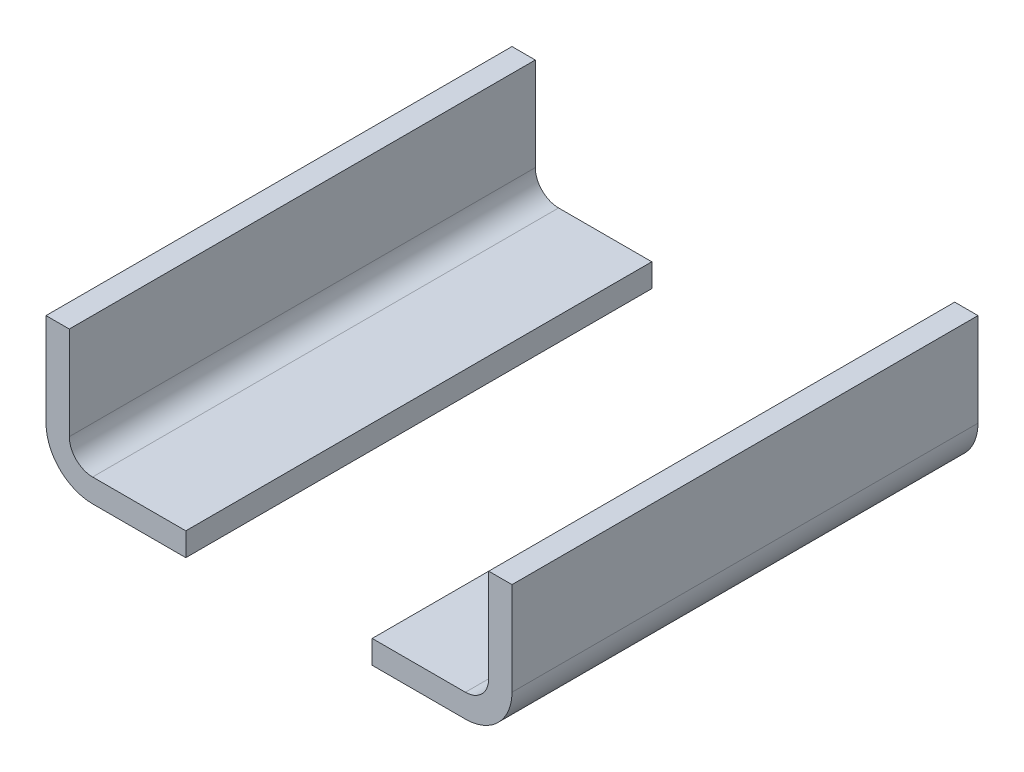
ISO-10303-21;
HEADER;
FILE_DESCRIPTION(('STEP AP214'),'2;1');
FILE_NAME('part.step','',(''),(''),'','','');
FILE_SCHEMA(('AUTOMOTIVE_DESIGN { 1 0 10303 214 1 1 1 1 }'));
ENDSEC;
DATA;
#1=APPLICATION_CONTEXT('core data for automotive mechanical design processes');
#2=APPLICATION_PROTOCOL_DEFINITION('international standard','automotive_design',2000,#1);
#3=PRODUCT_CONTEXT('',#1,'mechanical');
#4=PRODUCT('Part','Part','',(#3));
#5=PRODUCT_RELATED_PRODUCT_CATEGORY('part','',(#4));
#6=PRODUCT_DEFINITION_FORMATION('','',#4);
#7=PRODUCT_DEFINITION_CONTEXT('part definition',#1,'design');
#8=PRODUCT_DEFINITION('design','',#6,#7);
#9=PRODUCT_DEFINITION_SHAPE('','',#8);
#10=(LENGTH_UNIT() NAMED_UNIT(*) SI_UNIT(.MILLI.,.METRE.));
#11=(NAMED_UNIT(*) PLANE_ANGLE_UNIT() SI_UNIT($,.RADIAN.));
#12=(NAMED_UNIT(*) SI_UNIT($,.STERADIAN.) SOLID_ANGLE_UNIT());
#13=UNCERTAINTY_MEASURE_WITH_UNIT(LENGTH_MEASURE(1.E-05),#10,'distance_accuracy_value','');
#14=(GEOMETRIC_REPRESENTATION_CONTEXT(3) GLOBAL_UNCERTAINTY_ASSIGNED_CONTEXT((#13)) GLOBAL_UNIT_ASSIGNED_CONTEXT((#10,
#11,#12)) REPRESENTATION_CONTEXT('',''));
#15=CARTESIAN_POINT('',(0.,0.,0.));
#16=DIRECTION('',(0.,0.,1.));
#17=DIRECTION('',(1.,0.,0.));
#18=AXIS2_PLACEMENT_3D('',#15,#16,#17);
#19=CARTESIAN_POINT('',(40.,0.,200.));
#20=DIRECTION('',(1.,0.,0.));
#21=DIRECTION('',(0.,0.,-1.));
#22=AXIS2_PLACEMENT_3D('',#19,#20,#21);
#23=PLANE('',#22);
#24=DIRECTION('',(0.,-1.,0.));
#25=VECTOR('',#24,1.);
#26=CARTESIAN_POINT('',(40.,0.,0.));
#27=LINE('',#26,#25);
#28=CARTESIAN_POINT('',(40.,10.,0.));
#29=VERTEX_POINT('',#28);
#30=CARTESIAN_POINT('',(40.,0.,0.));
#31=VERTEX_POINT('',#30);
#32=EDGE_CURVE('E143',#29,#31,#27,.T.);
#33=ORIENTED_EDGE('',*,*,#32,.T.);
#34=DIRECTION('',(0.,0.,-1.));
#35=VECTOR('',#34,1.);
#36=CARTESIAN_POINT('',(40.,0.,200.));
#37=LINE('',#36,#35);
#38=CARTESIAN_POINT('',(40.,0.,200.));
#39=VERTEX_POINT('',#38);
#40=EDGE_CURVE('E12',#39,#31,#37,.T.);
#41=ORIENTED_EDGE('',*,*,#40,.F.);
#42=DIRECTION('',(0.,-1.,0.));
#43=VECTOR('',#42,1.);
#44=CARTESIAN_POINT('',(40.,0.,200.));
#45=LINE('',#44,#43);
#46=CARTESIAN_POINT('',(40.,10.,200.));
#47=VERTEX_POINT('',#46);
#48=EDGE_CURVE('E157',#47,#39,#45,.T.);
#49=ORIENTED_EDGE('',*,*,#48,.F.);
#50=DIRECTION('',(0.,0.,-1.));
#51=VECTOR('',#50,1.);
#52=CARTESIAN_POINT('',(40.,10.,200.));
#53=LINE('',#52,#51);
#54=EDGE_CURVE('E139',#47,#29,#53,.T.);
#55=ORIENTED_EDGE('',*,*,#54,.T.);
#56=EDGE_LOOP('',(#33,#41,#49,#55));
#57=FACE_BOUND('',#56,.T.);
#58=ADVANCED_FACE('F47',(#57),#23,.F.);
#59=CARTESIAN_POINT('',(40.,0.,200.));
#60=DIRECTION('',(0.,1.,0.));
#61=DIRECTION('',(-1.,0.,0.));
#62=AXIS2_PLACEMENT_3D('',#59,#60,#61);
#63=PLANE('',#62);
#64=DIRECTION('',(1.,0.,0.));
#65=VECTOR('',#64,1.);
#66=CARTESIAN_POINT('',(40.,0.,0.));
#67=LINE('',#66,#65);
#68=CARTESIAN_POINT('',(80.,0.,0.));
#69=VERTEX_POINT('',#68);
#70=EDGE_CURVE('E146',#31,#69,#67,.T.);
#71=ORIENTED_EDGE('',*,*,#70,.T.);
#72=DIRECTION('',(0.,0.,-1.));
#73=VECTOR('',#72,1.);
#74=CARTESIAN_POINT('',(80.,0.,200.));
#75=LINE('',#74,#73);
#76=CARTESIAN_POINT('',(80.,0.,200.));
#77=VERTEX_POINT('',#76);
#78=EDGE_CURVE('E55',#77,#69,#75,.T.);
#79=ORIENTED_EDGE('',*,*,#78,.F.);
#80=DIRECTION('',(1.,0.,0.));
#81=VECTOR('',#80,1.);
#82=CARTESIAN_POINT('',(40.,0.,200.));
#83=LINE('',#82,#81);
#84=EDGE_CURVE('E106',#39,#77,#83,.T.);
#85=ORIENTED_EDGE('',*,*,#84,.F.);
#86=ORIENTED_EDGE('',*,*,#40,.T.);
#87=EDGE_LOOP('',(#71,#79,#85,#86));
#88=FACE_BOUND('',#87,.T.);
#89=ADVANCED_FACE('F192',(#88),#63,.F.);
#90=CARTESIAN_POINT('',(80.,20.,200.));
#91=DIRECTION('',(0.,0.,-1.));
#92=DIRECTION('',(-1.,0.,0.));
#93=AXIS2_PLACEMENT_3D('',#90,#91,#92);
#94=CYLINDRICAL_SURFACE('',#93,20.);
#95=CARTESIAN_POINT('',(80.,20.,0.));
#96=DIRECTION('',(0.,0.,1.));
#97=DIRECTION('',(1.,0.,0.));
#98=AXIS2_PLACEMENT_3D('',#95,#96,#97);
#99=CIRCLE('',#98,20.);
#100=CARTESIAN_POINT('',(100.,20.,0.));
#101=VERTEX_POINT('',#100);
#102=EDGE_CURVE('E148',#69,#101,#99,.T.);
#103=ORIENTED_EDGE('',*,*,#102,.T.);
#104=DIRECTION('',(0.,0.,-1.));
#105=VECTOR('',#104,1.);
#106=CARTESIAN_POINT('',(100.,20.,200.));
#107=LINE('',#106,#105);
#108=CARTESIAN_POINT('',(100.,20.,200.));
#109=VERTEX_POINT('',#108);
#110=EDGE_CURVE('E164',#109,#101,#107,.T.);
#111=ORIENTED_EDGE('',*,*,#110,.F.);
#112=CARTESIAN_POINT('',(80.,20.,200.));
#113=DIRECTION('',(0.,0.,1.));
#114=DIRECTION('',(1.,0.,0.));
#115=AXIS2_PLACEMENT_3D('',#112,#113,#114);
#116=CIRCLE('',#115,20.);
#117=EDGE_CURVE('E172',#77,#109,#116,.T.);
#118=ORIENTED_EDGE('',*,*,#117,.F.);
#119=ORIENTED_EDGE('',*,*,#78,.T.);
#120=EDGE_LOOP('',(#103,#111,#118,#119));
#121=FACE_BOUND('',#120,.T.);
#122=ADVANCED_FACE('F170',(#121),#94,.T.);
#123=CARTESIAN_POINT('',(100.,20.,200.));
#124=DIRECTION('',(-1.,0.,0.));
#125=DIRECTION('',(0.,0.,1.));
#126=AXIS2_PLACEMENT_3D('',#123,#124,#125);
#127=PLANE('',#126);
#128=DIRECTION('',(0.,1.,0.));
#129=VECTOR('',#128,1.);
#130=CARTESIAN_POINT('',(100.,20.,0.));
#131=LINE('',#130,#129);
#132=CARTESIAN_POINT('',(100.,60.,0.));
#133=VERTEX_POINT('',#132);
#134=EDGE_CURVE('E150',#101,#133,#131,.T.);
#135=ORIENTED_EDGE('',*,*,#134,.T.);
#136=DIRECTION('',(0.,0.,-1.));
#137=VECTOR('',#136,1.);
#138=CARTESIAN_POINT('',(100.,60.,200.));
#139=LINE('',#138,#137);
#140=CARTESIAN_POINT('',(100.,60.,200.));
#141=VERTEX_POINT('',#140);
#142=EDGE_CURVE('E161',#141,#133,#139,.T.);
#143=ORIENTED_EDGE('',*,*,#142,.F.);
#144=DIRECTION('',(0.,1.,0.));
#145=VECTOR('',#144,1.);
#146=CARTESIAN_POINT('',(100.,20.,200.));
#147=LINE('',#146,#145);
#148=EDGE_CURVE('E184',#109,#141,#147,.T.);
#149=ORIENTED_EDGE('',*,*,#148,.F.);
#150=ORIENTED_EDGE('',*,*,#110,.T.);
#151=EDGE_LOOP('',(#135,#143,#149,#150));
#152=FACE_BOUND('',#151,.T.);
#153=ADVANCED_FACE('F180',(#152),#127,.F.);
#154=CARTESIAN_POINT('',(90.,60.,200.));
#155=DIRECTION('',(0.,-1.,0.));
#156=DIRECTION('',(0.,0.,-1.));
#157=AXIS2_PLACEMENT_3D('',#154,#155,#156);
#158=PLANE('',#157);
#159=DIRECTION('',(-1.,0.,0.));
#160=VECTOR('',#159,1.);
#161=CARTESIAN_POINT('',(90.,60.,0.));
#162=LINE('',#161,#160);
#163=CARTESIAN_POINT('',(90.,60.,0.));
#164=VERTEX_POINT('',#163);
#165=EDGE_CURVE('E152',#133,#164,#162,.T.);
#166=ORIENTED_EDGE('',*,*,#165,.T.);
#167=DIRECTION('',(0.,0.,-1.));
#168=VECTOR('',#167,1.);
#169=CARTESIAN_POINT('',(90.,60.,200.));
#170=LINE('',#169,#168);
#171=CARTESIAN_POINT('',(90.,60.,200.));
#172=VERTEX_POINT('',#171);
#173=EDGE_CURVE('E134',#172,#164,#170,.T.);
#174=ORIENTED_EDGE('',*,*,#173,.F.);
#175=DIRECTION('',(-1.,0.,0.));
#176=VECTOR('',#175,1.);
#177=CARTESIAN_POINT('',(90.,60.,200.));
#178=LINE('',#177,#176);
#179=EDGE_CURVE('E125',#141,#172,#178,.T.);
#180=ORIENTED_EDGE('',*,*,#179,.F.);
#181=ORIENTED_EDGE('',*,*,#142,.T.);
#182=EDGE_LOOP('',(#166,#174,#180,#181));
#183=FACE_BOUND('',#182,.T.);
#184=ADVANCED_FACE('F183',(#183),#158,.F.);
#185=CARTESIAN_POINT('',(90.,20.,200.));
#186=DIRECTION('',(1.,0.,0.));
#187=DIRECTION('',(0.,0.,-1.));
#188=AXIS2_PLACEMENT_3D('',#185,#186,#187);
#189=PLANE('',#188);
#190=DIRECTION('',(0.,-1.,0.));
#191=VECTOR('',#190,1.);
#192=CARTESIAN_POINT('',(90.,20.,0.));
#193=LINE('',#192,#191);
#194=CARTESIAN_POINT('',(90.,20.,0.));
#195=VERTEX_POINT('',#194);
#196=EDGE_CURVE('E133',#164,#195,#193,.T.);
#197=ORIENTED_EDGE('',*,*,#196,.T.);
#198=DIRECTION('',(0.,0.,-1.));
#199=VECTOR('',#198,1.);
#200=CARTESIAN_POINT('',(90.,20.,200.));
#201=LINE('',#200,#199);
#202=CARTESIAN_POINT('',(90.,20.,200.));
#203=VERTEX_POINT('',#202);
#204=EDGE_CURVE('E130',#203,#195,#201,.T.);
#205=ORIENTED_EDGE('',*,*,#204,.F.);
#206=DIRECTION('',(0.,-1.,0.));
#207=VECTOR('',#206,1.);
#208=CARTESIAN_POINT('',(90.,20.,200.));
#209=LINE('',#208,#207);
#210=EDGE_CURVE('E119',#172,#203,#209,.T.);
#211=ORIENTED_EDGE('',*,*,#210,.F.);
#212=ORIENTED_EDGE('',*,*,#173,.T.);
#213=EDGE_LOOP('',(#197,#205,#211,#212));
#214=FACE_BOUND('',#213,.T.);
#215=ADVANCED_FACE('F131',(#214),#189,.F.);
#216=CARTESIAN_POINT('',(80.,20.,200.));
#217=DIRECTION('',(0.,0.,-1.));
#218=DIRECTION('',(-1.,0.,0.));
#219=AXIS2_PLACEMENT_3D('',#216,#217,#218);
#220=CYLINDRICAL_SURFACE('',#219,9.99999999999999);
#221=CARTESIAN_POINT('',(80.,20.,0.));
#222=DIRECTION('',(0.,0.,-1.));
#223=DIRECTION('',(1.,0.,0.));
#224=AXIS2_PLACEMENT_3D('',#221,#222,#223);
#225=CIRCLE('',#224,9.99999999999999);
#226=CARTESIAN_POINT('',(80.,10.,0.));
#227=VERTEX_POINT('',#226);
#228=EDGE_CURVE('E92',#195,#227,#225,.T.);
#229=ORIENTED_EDGE('',*,*,#228,.T.);
#230=DIRECTION('',(0.,0.,-1.));
#231=VECTOR('',#230,1.);
#232=CARTESIAN_POINT('',(80.,10.,200.));
#233=LINE('',#232,#231);
#234=CARTESIAN_POINT('',(80.,10.,200.));
#235=VERTEX_POINT('',#234);
#236=EDGE_CURVE('E135',#235,#227,#233,.T.);
#237=ORIENTED_EDGE('',*,*,#236,.F.);
#238=CARTESIAN_POINT('',(80.,20.,200.));
#239=DIRECTION('',(0.,0.,-1.));
#240=DIRECTION('',(1.,0.,0.));
#241=AXIS2_PLACEMENT_3D('',#238,#239,#240);
#242=CIRCLE('',#241,9.99999999999999);
#243=EDGE_CURVE('E123',#203,#235,#242,.T.);
#244=ORIENTED_EDGE('',*,*,#243,.F.);
#245=ORIENTED_EDGE('',*,*,#204,.T.);
#246=EDGE_LOOP('',(#229,#237,#244,#245));
#247=FACE_BOUND('',#246,.T.);
#248=ADVANCED_FACE('F137',(#247),#220,.F.);
#249=CARTESIAN_POINT('',(40.,10.,200.));
#250=DIRECTION('',(0.,-1.,0.));
#251=DIRECTION('',(1.,0.,0.));
#252=AXIS2_PLACEMENT_3D('',#249,#250,#251);
#253=PLANE('',#252);
#254=DIRECTION('',(-1.,0.,0.));
#255=VECTOR('',#254,1.);
#256=CARTESIAN_POINT('',(40.,10.,0.));
#257=LINE('',#256,#255);
#258=EDGE_CURVE('E98',#227,#29,#257,.T.);
#259=ORIENTED_EDGE('',*,*,#258,.T.);
#260=ORIENTED_EDGE('',*,*,#54,.F.);
#261=DIRECTION('',(-1.,0.,0.));
#262=VECTOR('',#261,1.);
#263=CARTESIAN_POINT('',(40.,10.,200.));
#264=LINE('',#263,#262);
#265=EDGE_CURVE('E63',#235,#47,#264,.T.);
#266=ORIENTED_EDGE('',*,*,#265,.F.);
#267=ORIENTED_EDGE('',*,*,#236,.T.);
#268=EDGE_LOOP('',(#259,#260,#266,#267));
#269=FACE_BOUND('',#268,.T.);
#270=ADVANCED_FACE('F208',(#269),#253,.F.);
#271=CARTESIAN_POINT('',(80.,20.,200.));
#272=DIRECTION('',(0.,0.,1.));
#273=DIRECTION('',(1.,0.,0.));
#274=AXIS2_PLACEMENT_3D('',#271,#272,#273);
#275=PLANE('',#274);
#276=ORIENTED_EDGE('',*,*,#48,.T.);
#277=ORIENTED_EDGE('',*,*,#84,.T.);
#278=ORIENTED_EDGE('',*,*,#117,.T.);
#279=ORIENTED_EDGE('',*,*,#148,.T.);
#280=ORIENTED_EDGE('',*,*,#179,.T.);
#281=ORIENTED_EDGE('',*,*,#210,.T.);
#282=ORIENTED_EDGE('',*,*,#243,.T.);
#283=ORIENTED_EDGE('',*,*,#265,.T.);
#284=EDGE_LOOP('',(#276,#277,#278,#279,#280,#281,#282,#283));
#285=FACE_BOUND('',#284,.T.);
#286=ADVANCED_FACE('F121',(#285),#275,.T.);
#287=CARTESIAN_POINT('',(80.,20.,0.));
#288=DIRECTION('',(0.,0.,1.));
#289=DIRECTION('',(1.,0.,0.));
#290=AXIS2_PLACEMENT_3D('',#287,#288,#289);
#291=PLANE('',#290);
#292=ORIENTED_EDGE('',*,*,#32,.F.);
#293=ORIENTED_EDGE('',*,*,#258,.F.);
#294=ORIENTED_EDGE('',*,*,#228,.F.);
#295=ORIENTED_EDGE('',*,*,#196,.F.);
#296=ORIENTED_EDGE('',*,*,#165,.F.);
#297=ORIENTED_EDGE('',*,*,#134,.F.);
#298=ORIENTED_EDGE('',*,*,#102,.F.);
#299=ORIENTED_EDGE('',*,*,#70,.F.);
#300=EDGE_LOOP('',(#292,#293,#294,#295,#296,#297,#298,#299));
#301=FACE_BOUND('',#300,.T.);
#302=ADVANCED_FACE('F176',(#301),#291,.F.);
#303=CLOSED_SHELL('',(#58,#89,#122,#153,#184,#215,#248,#270,#286,#302));
#304=MANIFOLD_SOLID_BREP('B2',#303);
#305=CARTESIAN_POINT('',(-40.,0.,200.));
#306=DIRECTION('',(-1.,0.,0.));
#307=DIRECTION('',(0.,0.,1.));
#308=AXIS2_PLACEMENT_3D('',#305,#306,#307);
#309=PLANE('',#308);
#310=DIRECTION('',(0.,1.,0.));
#311=VECTOR('',#310,1.);
#312=CARTESIAN_POINT('',(-40.,0.,0.));
#313=LINE('',#312,#311);
#314=CARTESIAN_POINT('',(-40.,0.,0.));
#315=VERTEX_POINT('',#314);
#316=CARTESIAN_POINT('',(-40.,10.,0.));
#317=VERTEX_POINT('',#316);
#318=EDGE_CURVE('E373',#315,#317,#313,.T.);
#319=ORIENTED_EDGE('',*,*,#318,.T.);
#320=DIRECTION('',(0.,0.,-1.));
#321=VECTOR('',#320,1.);
#322=CARTESIAN_POINT('',(-40.,10.,200.));
#323=LINE('',#322,#321);
#324=CARTESIAN_POINT('',(-40.,10.,200.));
#325=VERTEX_POINT('',#324);
#326=EDGE_CURVE('E45',#325,#317,#323,.T.);
#327=ORIENTED_EDGE('',*,*,#326,.F.);
#328=DIRECTION('',(0.,1.,0.));
#329=VECTOR('',#328,1.);
#330=CARTESIAN_POINT('',(-40.,0.,200.));
#331=LINE('',#330,#329);
#332=CARTESIAN_POINT('',(-40.,0.,200.));
#333=VERTEX_POINT('',#332);
#334=EDGE_CURVE('E387',#333,#325,#331,.T.);
#335=ORIENTED_EDGE('',*,*,#334,.F.);
#336=DIRECTION('',(0.,0.,-1.));
#337=VECTOR('',#336,1.);
#338=CARTESIAN_POINT('',(-40.,0.,200.));
#339=LINE('',#338,#337);
#340=EDGE_CURVE('E369',#333,#315,#339,.T.);
#341=ORIENTED_EDGE('',*,*,#340,.T.);
#342=EDGE_LOOP('',(#319,#327,#335,#341));
#343=FACE_BOUND('',#342,.T.);
#344=ADVANCED_FACE('F277',(#343),#309,.F.);
#345=CARTESIAN_POINT('',(-40.,10.,200.));
#346=DIRECTION('',(0.,-1.,0.));
#347=DIRECTION('',(1.,0.,0.));
#348=AXIS2_PLACEMENT_3D('',#345,#346,#347);
#349=PLANE('',#348);
#350=DIRECTION('',(-1.,0.,0.));
#351=VECTOR('',#350,1.);
#352=CARTESIAN_POINT('',(-40.,10.,0.));
#353=LINE('',#352,#351);
#354=CARTESIAN_POINT('',(-80.,10.,0.));
#355=VERTEX_POINT('',#354);
#356=EDGE_CURVE('E376',#317,#355,#353,.T.);
#357=ORIENTED_EDGE('',*,*,#356,.T.);
#358=DIRECTION('',(0.,0.,-1.));
#359=VECTOR('',#358,1.);
#360=CARTESIAN_POINT('',(-80.,10.,200.));
#361=LINE('',#360,#359);
#362=CARTESIAN_POINT('',(-80.,10.,200.));
#363=VERTEX_POINT('',#362);
#364=EDGE_CURVE('E285',#363,#355,#361,.T.);
#365=ORIENTED_EDGE('',*,*,#364,.F.);
#366=DIRECTION('',(-1.,0.,0.));
#367=VECTOR('',#366,1.);
#368=CARTESIAN_POINT('',(-40.,10.,200.));
#369=LINE('',#368,#367);
#370=EDGE_CURVE('E336',#325,#363,#369,.T.);
#371=ORIENTED_EDGE('',*,*,#370,.F.);
#372=ORIENTED_EDGE('',*,*,#326,.T.);
#373=EDGE_LOOP('',(#357,#365,#371,#372));
#374=FACE_BOUND('',#373,.T.);
#375=ADVANCED_FACE('F422',(#374),#349,.F.);
#376=CARTESIAN_POINT('',(-80.,20.,200.));
#377=DIRECTION('',(0.,0.,-1.));
#378=DIRECTION('',(-1.,0.,0.));
#379=AXIS2_PLACEMENT_3D('',#376,#377,#378);
#380=CYLINDRICAL_SURFACE('',#379,10.);
#381=CARTESIAN_POINT('',(-80.,20.,0.));
#382=DIRECTION('',(0.,0.,-1.));
#383=DIRECTION('',(-1.,0.,0.));
#384=AXIS2_PLACEMENT_3D('',#381,#382,#383);
#385=CIRCLE('',#384,10.);
#386=CARTESIAN_POINT('',(-90.,20.,0.));
#387=VERTEX_POINT('',#386);
#388=EDGE_CURVE('E378',#355,#387,#385,.T.);
#389=ORIENTED_EDGE('',*,*,#388,.T.);
#390=DIRECTION('',(0.,0.,-1.));
#391=VECTOR('',#390,1.);
#392=CARTESIAN_POINT('',(-90.,20.,200.));
#393=LINE('',#392,#391);
#394=CARTESIAN_POINT('',(-90.,20.,200.));
#395=VERTEX_POINT('',#394);
#396=EDGE_CURVE('E394',#395,#387,#393,.T.);
#397=ORIENTED_EDGE('',*,*,#396,.F.);
#398=CARTESIAN_POINT('',(-80.,20.,200.));
#399=DIRECTION('',(0.,0.,-1.));
#400=DIRECTION('',(-1.,0.,0.));
#401=AXIS2_PLACEMENT_3D('',#398,#399,#400);
#402=CIRCLE('',#401,10.);
#403=EDGE_CURVE('E402',#363,#395,#402,.T.);
#404=ORIENTED_EDGE('',*,*,#403,.F.);
#405=ORIENTED_EDGE('',*,*,#364,.T.);
#406=EDGE_LOOP('',(#389,#397,#404,#405));
#407=FACE_BOUND('',#406,.T.);
#408=ADVANCED_FACE('F400',(#407),#380,.F.);
#409=CARTESIAN_POINT('',(-90.,20.,200.));
#410=DIRECTION('',(-1.,0.,0.));
#411=DIRECTION('',(0.,-1.,0.));
#412=AXIS2_PLACEMENT_3D('',#409,#410,#411);
#413=PLANE('',#412);
#414=DIRECTION('',(0.,1.,0.));
#415=VECTOR('',#414,1.);
#416=CARTESIAN_POINT('',(-90.,20.,0.));
#417=LINE('',#416,#415);
#418=CARTESIAN_POINT('',(-90.,60.,0.));
#419=VERTEX_POINT('',#418);
#420=EDGE_CURVE('E380',#387,#419,#417,.T.);
#421=ORIENTED_EDGE('',*,*,#420,.T.);
#422=DIRECTION('',(0.,0.,-1.));
#423=VECTOR('',#422,1.);
#424=CARTESIAN_POINT('',(-90.,60.,200.));
#425=LINE('',#424,#423);
#426=CARTESIAN_POINT('',(-90.,60.,200.));
#427=VERTEX_POINT('',#426);
#428=EDGE_CURVE('E391',#427,#419,#425,.T.);
#429=ORIENTED_EDGE('',*,*,#428,.F.);
#430=DIRECTION('',(0.,1.,0.));
#431=VECTOR('',#430,1.);
#432=CARTESIAN_POINT('',(-90.,20.,200.));
#433=LINE('',#432,#431);
#434=EDGE_CURVE('E414',#395,#427,#433,.T.);
#435=ORIENTED_EDGE('',*,*,#434,.F.);
#436=ORIENTED_EDGE('',*,*,#396,.T.);
#437=EDGE_LOOP('',(#421,#429,#435,#436));
#438=FACE_BOUND('',#437,.T.);
#439=ADVANCED_FACE('F410',(#438),#413,.F.);
#440=CARTESIAN_POINT('',(-90.,60.,200.));
#441=DIRECTION('',(0.,-1.,0.));
#442=DIRECTION('',(0.,0.,-1.));
#443=AXIS2_PLACEMENT_3D('',#440,#441,#442);
#444=PLANE('',#443);
#445=DIRECTION('',(-1.,0.,0.));
#446=VECTOR('',#445,1.);
#447=CARTESIAN_POINT('',(-90.,60.,0.));
#448=LINE('',#447,#446);
#449=CARTESIAN_POINT('',(-100.,60.,0.));
#450=VERTEX_POINT('',#449);
#451=EDGE_CURVE('E382',#419,#450,#448,.T.);
#452=ORIENTED_EDGE('',*,*,#451,.T.);
#453=DIRECTION('',(0.,0.,-1.));
#454=VECTOR('',#453,1.);
#455=CARTESIAN_POINT('',(-100.,60.,200.));
#456=LINE('',#455,#454);
#457=CARTESIAN_POINT('',(-100.,60.,200.));
#458=VERTEX_POINT('',#457);
#459=EDGE_CURVE('E364',#458,#450,#456,.T.);
#460=ORIENTED_EDGE('',*,*,#459,.F.);
#461=DIRECTION('',(-1.,0.,0.));
#462=VECTOR('',#461,1.);
#463=CARTESIAN_POINT('',(-90.,60.,200.));
#464=LINE('',#463,#462);
#465=EDGE_CURVE('E355',#427,#458,#464,.T.);
#466=ORIENTED_EDGE('',*,*,#465,.F.);
#467=ORIENTED_EDGE('',*,*,#428,.T.);
#468=EDGE_LOOP('',(#452,#460,#466,#467));
#469=FACE_BOUND('',#468,.T.);
#470=ADVANCED_FACE('F413',(#469),#444,.F.);
#471=CARTESIAN_POINT('',(-100.,20.,200.));
#472=DIRECTION('',(1.,0.,0.));
#473=DIRECTION('',(0.,0.,-1.));
#474=AXIS2_PLACEMENT_3D('',#471,#472,#473);
#475=PLANE('',#474);
#476=DIRECTION('',(0.,-1.,0.));
#477=VECTOR('',#476,1.);
#478=CARTESIAN_POINT('',(-100.,20.,0.));
#479=LINE('',#478,#477);
#480=CARTESIAN_POINT('',(-100.,20.,0.));
#481=VERTEX_POINT('',#480);
#482=EDGE_CURVE('E363',#450,#481,#479,.T.);
#483=ORIENTED_EDGE('',*,*,#482,.T.);
#484=DIRECTION('',(0.,0.,-1.));
#485=VECTOR('',#484,1.);
#486=CARTESIAN_POINT('',(-100.,20.,200.));
#487=LINE('',#486,#485);
#488=CARTESIAN_POINT('',(-100.,20.,200.));
#489=VERTEX_POINT('',#488);
#490=EDGE_CURVE('E360',#489,#481,#487,.T.);
#491=ORIENTED_EDGE('',*,*,#490,.F.);
#492=DIRECTION('',(0.,-1.,0.));
#493=VECTOR('',#492,1.);
#494=CARTESIAN_POINT('',(-100.,20.,200.));
#495=LINE('',#494,#493);
#496=EDGE_CURVE('E349',#458,#489,#495,.T.);
#497=ORIENTED_EDGE('',*,*,#496,.F.);
#498=ORIENTED_EDGE('',*,*,#459,.T.);
#499=EDGE_LOOP('',(#483,#491,#497,#498));
#500=FACE_BOUND('',#499,.T.);
#501=ADVANCED_FACE('F361',(#500),#475,.F.);
#502=CARTESIAN_POINT('',(-80.,20.,200.));
#503=DIRECTION('',(0.,0.,-1.));
#504=DIRECTION('',(-1.,0.,0.));
#505=AXIS2_PLACEMENT_3D('',#502,#503,#504);
#506=CYLINDRICAL_SURFACE('',#505,20.);
#507=CARTESIAN_POINT('',(-80.,20.,0.));
#508=DIRECTION('',(0.,0.,1.));
#509=DIRECTION('',(-1.,0.,0.));
#510=AXIS2_PLACEMENT_3D('',#507,#508,#509);
#511=CIRCLE('',#510,20.);
#512=CARTESIAN_POINT('',(-80.,0.,0.));
#513=VERTEX_POINT('',#512);
#514=EDGE_CURVE('E322',#481,#513,#511,.T.);
#515=ORIENTED_EDGE('',*,*,#514,.T.);
#516=DIRECTION('',(0.,0.,-1.));
#517=VECTOR('',#516,1.);
#518=CARTESIAN_POINT('',(-80.,0.,200.));
#519=LINE('',#518,#517);
#520=CARTESIAN_POINT('',(-80.,0.,200.));
#521=VERTEX_POINT('',#520);
#522=EDGE_CURVE('E365',#521,#513,#519,.T.);
#523=ORIENTED_EDGE('',*,*,#522,.F.);
#524=CARTESIAN_POINT('',(-80.,20.,200.));
#525=DIRECTION('',(0.,0.,1.));
#526=DIRECTION('',(-1.,0.,0.));
#527=AXIS2_PLACEMENT_3D('',#524,#525,#526);
#528=CIRCLE('',#527,20.);
#529=EDGE_CURVE('E353',#489,#521,#528,.T.);
#530=ORIENTED_EDGE('',*,*,#529,.F.);
#531=ORIENTED_EDGE('',*,*,#490,.T.);
#532=EDGE_LOOP('',(#515,#523,#530,#531));
#533=FACE_BOUND('',#532,.T.);
#534=ADVANCED_FACE('F367',(#533),#506,.T.);
#535=CARTESIAN_POINT('',(-40.,0.,200.));
#536=DIRECTION('',(0.,1.,0.));
#537=DIRECTION('',(-1.,0.,0.));
#538=AXIS2_PLACEMENT_3D('',#535,#536,#537);
#539=PLANE('',#538);
#540=DIRECTION('',(1.,0.,0.));
#541=VECTOR('',#540,1.);
#542=CARTESIAN_POINT('',(-40.,0.,0.));
#543=LINE('',#542,#541);
#544=EDGE_CURVE('E328',#513,#315,#543,.T.);
#545=ORIENTED_EDGE('',*,*,#544,.T.);
#546=ORIENTED_EDGE('',*,*,#340,.F.);
#547=DIRECTION('',(1.,0.,0.));
#548=VECTOR('',#547,1.);
#549=CARTESIAN_POINT('',(-40.,0.,200.));
#550=LINE('',#549,#548);
#551=EDGE_CURVE('E293',#521,#333,#550,.T.);
#552=ORIENTED_EDGE('',*,*,#551,.F.);
#553=ORIENTED_EDGE('',*,*,#522,.T.);
#554=EDGE_LOOP('',(#545,#546,#552,#553));
#555=FACE_BOUND('',#554,.T.);
#556=ADVANCED_FACE('F438',(#555),#539,.F.);
#557=CARTESIAN_POINT('',(-80.,20.,200.));
#558=DIRECTION('',(0.,0.,-1.));
#559=DIRECTION('',(-1.,0.,0.));
#560=AXIS2_PLACEMENT_3D('',#557,#558,#559);
#561=PLANE('',#560);
#562=ORIENTED_EDGE('',*,*,#334,.T.);
#563=ORIENTED_EDGE('',*,*,#370,.T.);
#564=ORIENTED_EDGE('',*,*,#403,.T.);
#565=ORIENTED_EDGE('',*,*,#434,.T.);
#566=ORIENTED_EDGE('',*,*,#465,.T.);
#567=ORIENTED_EDGE('',*,*,#496,.T.);
#568=ORIENTED_EDGE('',*,*,#529,.T.);
#569=ORIENTED_EDGE('',*,*,#551,.T.);
#570=EDGE_LOOP('',(#562,#563,#564,#565,#566,#567,#568,#569));
#571=FACE_BOUND('',#570,.T.);
#572=ADVANCED_FACE('F351',(#571),#561,.F.);
#573=CARTESIAN_POINT('',(-80.,20.,0.));
#574=DIRECTION('',(0.,0.,-1.));
#575=DIRECTION('',(-1.,0.,0.));
#576=AXIS2_PLACEMENT_3D('',#573,#574,#575);
#577=PLANE('',#576);
#578=ORIENTED_EDGE('',*,*,#318,.F.);
#579=ORIENTED_EDGE('',*,*,#544,.F.);
#580=ORIENTED_EDGE('',*,*,#514,.F.);
#581=ORIENTED_EDGE('',*,*,#482,.F.);
#582=ORIENTED_EDGE('',*,*,#451,.F.);
#583=ORIENTED_EDGE('',*,*,#420,.F.);
#584=ORIENTED_EDGE('',*,*,#388,.F.);
#585=ORIENTED_EDGE('',*,*,#356,.F.);
#586=EDGE_LOOP('',(#578,#579,#580,#581,#582,#583,#584,#585));
#587=FACE_BOUND('',#586,.T.);
#588=ADVANCED_FACE('F406',(#587),#577,.T.);
#589=CLOSED_SHELL('',(#344,#375,#408,#439,#470,#501,#534,#556,#572,#588));
#590=MANIFOLD_SOLID_BREP('B6',#589);
#591=ADVANCED_BREP_SHAPE_REPRESENTATION('',(#18,#304,#590),#14);
#592=SHAPE_DEFINITION_REPRESENTATION(#9,#591);
ENDSEC;
END-ISO-10303-21;
